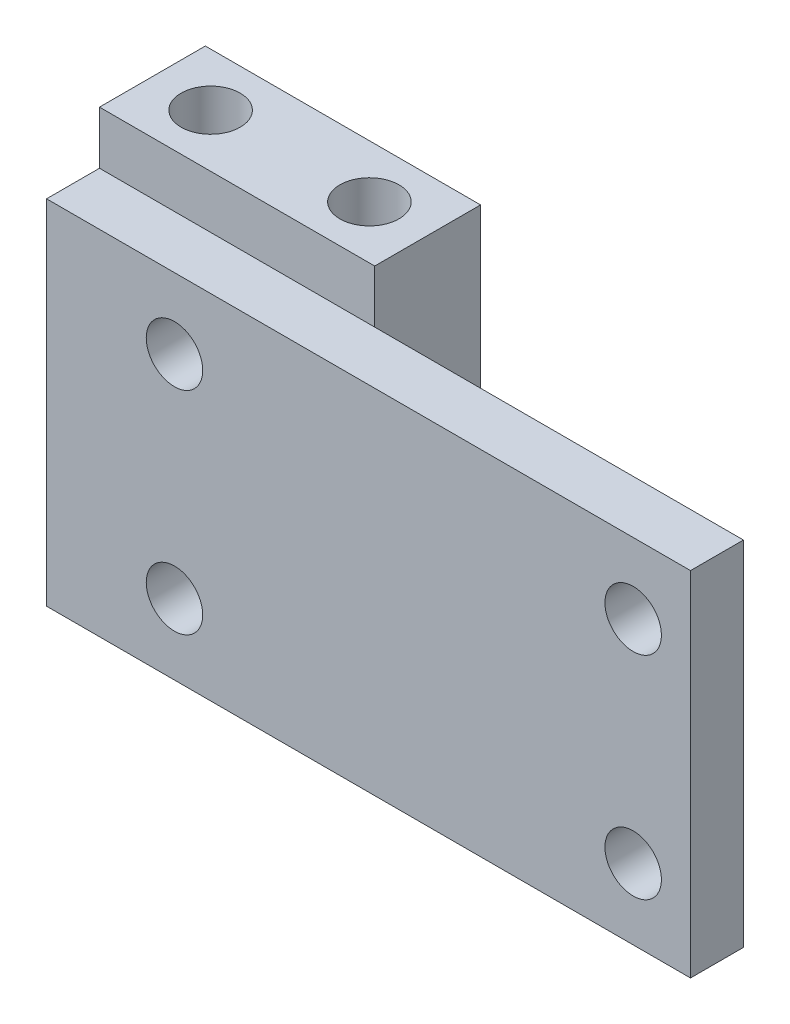
ISO-10303-21;
HEADER;
FILE_DESCRIPTION(('STEP AP214'),'2;1');
FILE_NAME('part.step','',(''),(''),'','','');
FILE_SCHEMA(('AUTOMOTIVE_DESIGN { 1 0 10303 214 1 1 1 1 }'));
ENDSEC;
DATA;
#1=APPLICATION_CONTEXT('core data for automotive mechanical design processes');
#2=APPLICATION_PROTOCOL_DEFINITION('international standard','automotive_design',2000,#1);
#3=PRODUCT_CONTEXT('',#1,'mechanical');
#4=PRODUCT('Part','Part','',(#3));
#5=PRODUCT_RELATED_PRODUCT_CATEGORY('part','',(#4));
#6=PRODUCT_DEFINITION_FORMATION('','',#4);
#7=PRODUCT_DEFINITION_CONTEXT('part definition',#1,'design');
#8=PRODUCT_DEFINITION('design','',#6,#7);
#9=PRODUCT_DEFINITION_SHAPE('','',#8);
#10=(LENGTH_UNIT() NAMED_UNIT(*) SI_UNIT(.MILLI.,.METRE.));
#11=(NAMED_UNIT(*) PLANE_ANGLE_UNIT() SI_UNIT($,.RADIAN.));
#12=(NAMED_UNIT(*) SI_UNIT($,.STERADIAN.) SOLID_ANGLE_UNIT());
#13=UNCERTAINTY_MEASURE_WITH_UNIT(LENGTH_MEASURE(1.E-05),#10,'distance_accuracy_value','');
#14=(GEOMETRIC_REPRESENTATION_CONTEXT(3) GLOBAL_UNCERTAINTY_ASSIGNED_CONTEXT((#13)) GLOBAL_UNIT_ASSIGNED_CONTEXT((#10,
#11,#12)) REPRESENTATION_CONTEXT('',''));
#15=CARTESIAN_POINT('',(0.,0.,0.));
#16=DIRECTION('',(0.,0.,1.));
#17=DIRECTION('',(1.,0.,0.));
#18=AXIS2_PLACEMENT_3D('',#15,#16,#17);
#19=CARTESIAN_POINT('',(0.,0.,6.));
#20=DIRECTION('',(0.,0.,-1.));
#21=DIRECTION('',(-1.,0.,0.));
#22=AXIS2_PLACEMENT_3D('',#19,#20,#21);
#23=PLANE('',#22);
#24=DIRECTION('',(-1.,0.,0.));
#25=VECTOR('',#24,1.);
#26=CARTESIAN_POINT('',(0.,23.,6.));
#27=LINE('',#26,#25);
#28=CARTESIAN_POINT('',(15.6,23.,6.));
#29=VERTEX_POINT('',#28);
#30=CARTESIAN_POINT('',(0.,23.,6.));
#31=VERTEX_POINT('',#30);
#32=EDGE_CURVE('E11',#29,#31,#27,.T.);
#33=ORIENTED_EDGE('',*,*,#32,.F.);
#34=DIRECTION('',(0.,1.,0.));
#35=VECTOR('',#34,1.);
#36=CARTESIAN_POINT('',(15.6,0.,6.));
#37=LINE('',#36,#35);
#38=CARTESIAN_POINT('',(15.6,26.,6.));
#39=VERTEX_POINT('',#38);
#40=EDGE_CURVE('E162',#29,#39,#37,.T.);
#41=ORIENTED_EDGE('',*,*,#40,.T.);
#42=DIRECTION('',(-1.,0.,0.));
#43=VECTOR('',#42,1.);
#44=CARTESIAN_POINT('',(0.,26.,6.));
#45=LINE('',#44,#43);
#46=CARTESIAN_POINT('',(0.,26.,6.));
#47=VERTEX_POINT('',#46);
#48=EDGE_CURVE('E165',#39,#47,#45,.T.);
#49=ORIENTED_EDGE('',*,*,#48,.T.);
#50=DIRECTION('',(0.,-1.,0.));
#51=VECTOR('',#50,1.);
#52=CARTESIAN_POINT('',(0.,0.,6.));
#53=LINE('',#52,#51);
#54=EDGE_CURVE('E158',#47,#31,#53,.T.);
#55=ORIENTED_EDGE('',*,*,#54,.T.);
#56=EDGE_LOOP('',(#33,#41,#49,#55));
#57=FACE_BOUND('',#56,.T.);
#58=ADVANCED_FACE('F33',(#57),#23,.F.);
#59=DIRECTION('',(1.,0.,0.));
#60=VECTOR('',#59,1.);
#61=CARTESIAN_POINT('',(0.,3.,6.));
#62=LINE('',#61,#60);
#63=CARTESIAN_POINT('',(0.,3.,6.));
#64=VERTEX_POINT('',#63);
#65=CARTESIAN_POINT('',(15.6,3.,6.));
#66=VERTEX_POINT('',#65);
#67=EDGE_CURVE('E57',#64,#66,#62,.T.);
#68=ORIENTED_EDGE('',*,*,#67,.F.);
#69=CARTESIAN_POINT('',(0.,0.,6.));
#70=VERTEX_POINT('',#69);
#71=EDGE_CURVE('E127',#64,#70,#53,.T.);
#72=ORIENTED_EDGE('',*,*,#71,.T.);
#73=DIRECTION('',(1.,0.,0.));
#74=VECTOR('',#73,1.);
#75=CARTESIAN_POINT('',(0.,0.,6.));
#76=LINE('',#75,#74);
#77=CARTESIAN_POINT('',(15.6,0.,6.));
#78=VERTEX_POINT('',#77);
#79=EDGE_CURVE('E160',#70,#78,#76,.T.);
#80=ORIENTED_EDGE('',*,*,#79,.T.);
#81=EDGE_CURVE('E163',#78,#66,#37,.T.);
#82=ORIENTED_EDGE('',*,*,#81,.T.);
#83=EDGE_LOOP('',(#68,#72,#80,#82));
#84=FACE_BOUND('',#83,.T.);
#85=ADVANCED_FACE('F285',(#84),#23,.F.);
#86=CARTESIAN_POINT('',(0.,0.,6.));
#87=DIRECTION('',(1.,0.,0.));
#88=DIRECTION('',(0.,0.,-1.));
#89=AXIS2_PLACEMENT_3D('',#86,#87,#88);
#90=PLANE('',#89);
#91=DIRECTION('',(0.,-1.,0.));
#92=VECTOR('',#91,1.);
#93=CARTESIAN_POINT('',(0.,0.,0.));
#94=LINE('',#93,#92);
#95=CARTESIAN_POINT('',(0.,26.,0.));
#96=VERTEX_POINT('',#95);
#97=CARTESIAN_POINT('',(0.,0.,0.));
#98=VERTEX_POINT('',#97);
#99=EDGE_CURVE('E149',#96,#98,#94,.T.);
#100=ORIENTED_EDGE('',*,*,#99,.T.);
#101=DIRECTION('',(0.,0.,-1.));
#102=VECTOR('',#101,1.);
#103=CARTESIAN_POINT('',(0.,0.,6.));
#104=LINE('',#103,#102);
#105=EDGE_CURVE('E42',#70,#98,#104,.T.);
#106=ORIENTED_EDGE('',*,*,#105,.F.);
#107=ORIENTED_EDGE('',*,*,#71,.F.);
#108=DIRECTION('',(0.,0.,-1.));
#109=VECTOR('',#108,1.);
#110=CARTESIAN_POINT('',(0.,3.,9.));
#111=LINE('',#110,#109);
#112=CARTESIAN_POINT('',(0.,3.,9.));
#113=VERTEX_POINT('',#112);
#114=EDGE_CURVE('E109',#113,#64,#111,.T.);
#115=ORIENTED_EDGE('',*,*,#114,.F.);
#116=DIRECTION('',(0.,-1.,0.));
#117=VECTOR('',#116,1.);
#118=CARTESIAN_POINT('',(0.,3.,9.));
#119=LINE('',#118,#117);
#120=CARTESIAN_POINT('',(0.,23.,9.));
#121=VERTEX_POINT('',#120);
#122=EDGE_CURVE('E115',#121,#113,#119,.T.);
#123=ORIENTED_EDGE('',*,*,#122,.F.);
#124=DIRECTION('',(0.,0.,-1.));
#125=VECTOR('',#124,1.);
#126=CARTESIAN_POINT('',(0.,23.,9.));
#127=LINE('',#126,#125);
#128=EDGE_CURVE('E219',#121,#31,#127,.T.);
#129=ORIENTED_EDGE('',*,*,#128,.T.);
#130=ORIENTED_EDGE('',*,*,#54,.F.);
#131=DIRECTION('',(0.,0.,-1.));
#132=VECTOR('',#131,1.);
#133=CARTESIAN_POINT('',(0.,26.,6.));
#134=LINE('',#133,#132);
#135=EDGE_CURVE('E168',#47,#96,#134,.T.);
#136=ORIENTED_EDGE('',*,*,#135,.T.);
#137=EDGE_LOOP('',(#100,#106,#107,#115,#123,#129,#130,#136));
#138=FACE_BOUND('',#137,.T.);
#139=ADVANCED_FACE('F35',(#138),#90,.F.);
#140=CARTESIAN_POINT('',(0.,0.,6.));
#141=DIRECTION('',(0.,1.,0.));
#142=DIRECTION('',(0.,0.,1.));
#143=AXIS2_PLACEMENT_3D('',#140,#141,#142);
#144=PLANE('',#143);
#145=CARTESIAN_POINT('',(12.3,0.,3.));
#146=DIRECTION('',(0.,-1.,0.));
#147=DIRECTION('',(0.,0.,-1.));
#148=AXIS2_PLACEMENT_3D('',#145,#146,#147);
#149=CIRCLE('',#148,1.675);
#150=CARTESIAN_POINT('',(12.3,0.,1.325));
#151=VERTEX_POINT('',#150);
#152=EDGE_CURVE('E141',#151,#151,#149,.T.);
#153=ORIENTED_EDGE('',*,*,#152,.F.);
#154=EDGE_LOOP('',(#153));
#155=FACE_BOUND('',#154,.T.);
#156=CARTESIAN_POINT('',(3.3,0.,3.));
#157=DIRECTION('',(0.,-1.,0.));
#158=DIRECTION('',(0.,0.,-1.));
#159=AXIS2_PLACEMENT_3D('',#156,#157,#158);
#160=CIRCLE('',#159,1.675);
#161=CARTESIAN_POINT('',(3.3,0.,1.325));
#162=VERTEX_POINT('',#161);
#163=EDGE_CURVE('E128',#162,#162,#160,.T.);
#164=ORIENTED_EDGE('',*,*,#163,.F.);
#165=EDGE_LOOP('',(#164));
#166=FACE_BOUND('',#165,.T.);
#167=DIRECTION('',(1.,0.,0.));
#168=VECTOR('',#167,1.);
#169=CARTESIAN_POINT('',(0.,0.,0.));
#170=LINE('',#169,#168);
#171=CARTESIAN_POINT('',(15.6,0.,0.));
#172=VERTEX_POINT('',#171);
#173=EDGE_CURVE('E170',#98,#172,#170,.T.);
#174=ORIENTED_EDGE('',*,*,#173,.T.);
#175=DIRECTION('',(0.,0.,-1.));
#176=VECTOR('',#175,1.);
#177=CARTESIAN_POINT('',(15.6,0.,6.));
#178=LINE('',#177,#176);
#179=EDGE_CURVE('E181',#78,#172,#178,.T.);
#180=ORIENTED_EDGE('',*,*,#179,.F.);
#181=ORIENTED_EDGE('',*,*,#79,.F.);
#182=ORIENTED_EDGE('',*,*,#105,.T.);
#183=EDGE_LOOP('',(#174,#180,#181,#182));
#184=FACE_BOUND('',#183,.T.);
#185=ADVANCED_FACE('F186',(#155,#166,#184),#144,.F.);
#186=CARTESIAN_POINT('',(15.6,0.,6.));
#187=DIRECTION('',(-1.,0.,0.));
#188=DIRECTION('',(0.,0.,1.));
#189=AXIS2_PLACEMENT_3D('',#186,#187,#188);
#190=PLANE('',#189);
#191=DIRECTION('',(0.,1.,0.));
#192=VECTOR('',#191,1.);
#193=CARTESIAN_POINT('',(15.6,0.,0.));
#194=LINE('',#193,#192);
#195=CARTESIAN_POINT('',(15.6,26.,0.));
#196=VERTEX_POINT('',#195);
#197=EDGE_CURVE('E172',#172,#196,#194,.T.);
#198=ORIENTED_EDGE('',*,*,#197,.T.);
#199=DIRECTION('',(0.,0.,-1.));
#200=VECTOR('',#199,1.);
#201=CARTESIAN_POINT('',(15.6,26.,6.));
#202=LINE('',#201,#200);
#203=EDGE_CURVE('E178',#39,#196,#202,.T.);
#204=ORIENTED_EDGE('',*,*,#203,.F.);
#205=ORIENTED_EDGE('',*,*,#40,.F.);
#206=EDGE_CURVE('E166',#66,#29,#37,.T.);
#207=ORIENTED_EDGE('',*,*,#206,.F.);
#208=ORIENTED_EDGE('',*,*,#81,.F.);
#209=ORIENTED_EDGE('',*,*,#179,.T.);
#210=EDGE_LOOP('',(#198,#204,#205,#207,#208,#209));
#211=FACE_BOUND('',#210,.T.);
#212=ADVANCED_FACE('F197',(#211),#190,.F.);
#213=CARTESIAN_POINT('',(0.,26.,6.));
#214=DIRECTION('',(0.,-1.,0.));
#215=DIRECTION('',(0.,0.,-1.));
#216=AXIS2_PLACEMENT_3D('',#213,#214,#215);
#217=PLANE('',#216);
#218=CARTESIAN_POINT('',(3.3,26.,3.));
#219=DIRECTION('',(0.,1.,0.));
#220=DIRECTION('',(0.,0.,1.));
#221=AXIS2_PLACEMENT_3D('',#218,#219,#220);
#222=CIRCLE('',#221,1.675);
#223=CARTESIAN_POINT('',(3.3,26.,4.675));
#224=VERTEX_POINT('',#223);
#225=EDGE_CURVE('E150',#224,#224,#222,.T.);
#226=ORIENTED_EDGE('',*,*,#225,.F.);
#227=EDGE_LOOP('',(#226));
#228=FACE_BOUND('',#227,.T.);
#229=CARTESIAN_POINT('',(12.3,26.,3.));
#230=DIRECTION('',(0.,1.,0.));
#231=DIRECTION('',(0.,0.,1.));
#232=AXIS2_PLACEMENT_3D('',#229,#230,#231);
#233=CIRCLE('',#232,1.675);
#234=CARTESIAN_POINT('',(12.3,26.,4.675));
#235=VERTEX_POINT('',#234);
#236=EDGE_CURVE('E140',#235,#235,#233,.T.);
#237=ORIENTED_EDGE('',*,*,#236,.F.);
#238=EDGE_LOOP('',(#237));
#239=FACE_BOUND('',#238,.T.);
#240=DIRECTION('',(-1.,0.,0.));
#241=VECTOR('',#240,1.);
#242=CARTESIAN_POINT('',(0.,26.,0.));
#243=LINE('',#242,#241);
#244=EDGE_CURVE('E174',#196,#96,#243,.T.);
#245=ORIENTED_EDGE('',*,*,#244,.T.);
#246=ORIENTED_EDGE('',*,*,#135,.F.);
#247=ORIENTED_EDGE('',*,*,#48,.F.);
#248=ORIENTED_EDGE('',*,*,#203,.T.);
#249=EDGE_LOOP('',(#245,#246,#247,#248));
#250=FACE_BOUND('',#249,.T.);
#251=ADVANCED_FACE('F201',(#228,#239,#250),#217,.F.);
#252=CARTESIAN_POINT('',(0.,0.,0.));
#253=DIRECTION('',(0.,0.,-1.));
#254=DIRECTION('',(-1.,0.,0.));
#255=AXIS2_PLACEMENT_3D('',#252,#253,#254);
#256=PLANE('',#255);
#257=CARTESIAN_POINT('',(7.25,19.,0.));
#258=DIRECTION('',(0.,0.,-1.));
#259=DIRECTION('',(-1.,0.,0.));
#260=AXIS2_PLACEMENT_3D('',#257,#258,#259);
#261=CIRCLE('',#260,3.3);
#262=CARTESIAN_POINT('',(3.95,19.,0.));
#263=VERTEX_POINT('',#262);
#264=EDGE_CURVE('E255',#263,#263,#261,.T.);
#265=ORIENTED_EDGE('',*,*,#264,.F.);
#266=EDGE_LOOP('',(#265));
#267=FACE_BOUND('',#266,.T.);
#268=CARTESIAN_POINT('',(7.25,7.,0.));
#269=DIRECTION('',(0.,0.,-1.));
#270=DIRECTION('',(-1.,0.,0.));
#271=AXIS2_PLACEMENT_3D('',#268,#269,#270);
#272=CIRCLE('',#271,3.3);
#273=CARTESIAN_POINT('',(3.95,7.,0.));
#274=VERTEX_POINT('',#273);
#275=EDGE_CURVE('E243',#274,#274,#272,.T.);
#276=ORIENTED_EDGE('',*,*,#275,.F.);
#277=EDGE_LOOP('',(#276));
#278=FACE_BOUND('',#277,.T.);
#279=ORIENTED_EDGE('',*,*,#99,.F.);
#280=ORIENTED_EDGE('',*,*,#244,.F.);
#281=ORIENTED_EDGE('',*,*,#197,.F.);
#282=ORIENTED_EDGE('',*,*,#173,.F.);
#283=EDGE_LOOP('',(#279,#280,#281,#282));
#284=FACE_BOUND('',#283,.T.);
#285=ADVANCED_FACE('F193',(#267,#278,#284),#256,.T.);
#286=CARTESIAN_POINT('',(12.3,21.5,3.));
#287=DIRECTION('',(0.,1.,0.));
#288=DIRECTION('',(0.,0.,1.));
#289=AXIS2_PLACEMENT_3D('',#286,#287,#288);
#290=CYLINDRICAL_SURFACE('',#289,1.675);
#291=CARTESIAN_POINT('',(12.3,21.5,3.));
#292=DIRECTION('',(0.,1.,0.));
#293=DIRECTION('',(0.,0.,1.));
#294=AXIS2_PLACEMENT_3D('',#291,#292,#293);
#295=CIRCLE('',#294,1.675);
#296=CARTESIAN_POINT('',(12.3,21.5,4.675));
#297=VERTEX_POINT('',#296);
#298=EDGE_CURVE('E153',#297,#297,#295,.T.);
#299=ORIENTED_EDGE('',*,*,#298,.F.);
#300=EDGE_LOOP('',(#299));
#301=FACE_BOUND('',#300,.T.);
#302=ORIENTED_EDGE('',*,*,#236,.T.);
#303=EDGE_LOOP('',(#302));
#304=FACE_BOUND('',#303,.T.);
#305=ADVANCED_FACE('F263',(#301,#304),#290,.F.);
#306=CARTESIAN_POINT('',(12.3,21.5,3.));
#307=DIRECTION('',(0.,1.,0.));
#308=DIRECTION('',(0.,0.,1.));
#309=AXIS2_PLACEMENT_3D('',#306,#307,#308);
#310=PLANE('',#309);
#311=ORIENTED_EDGE('',*,*,#298,.T.);
#312=EDGE_LOOP('',(#311));
#313=FACE_BOUND('',#312,.T.);
#314=ADVANCED_FACE('F328',(#313),#310,.T.);
#315=CARTESIAN_POINT('',(3.3,21.5,3.));
#316=DIRECTION('',(0.,1.,0.));
#317=DIRECTION('',(0.,0.,1.));
#318=AXIS2_PLACEMENT_3D('',#315,#316,#317);
#319=CYLINDRICAL_SURFACE('',#318,1.675);
#320=CARTESIAN_POINT('',(3.3,21.5,3.));
#321=DIRECTION('',(0.,1.,0.));
#322=DIRECTION('',(0.,0.,1.));
#323=AXIS2_PLACEMENT_3D('',#320,#321,#322);
#324=CIRCLE('',#323,1.675);
#325=CARTESIAN_POINT('',(3.3,21.5,4.675));
#326=VERTEX_POINT('',#325);
#327=EDGE_CURVE('E146',#326,#326,#324,.T.);
#328=ORIENTED_EDGE('',*,*,#327,.F.);
#329=EDGE_LOOP('',(#328));
#330=FACE_BOUND('',#329,.T.);
#331=ORIENTED_EDGE('',*,*,#225,.T.);
#332=EDGE_LOOP('',(#331));
#333=FACE_BOUND('',#332,.T.);
#334=ADVANCED_FACE('F321',(#330,#333),#319,.F.);
#335=CARTESIAN_POINT('',(3.3,21.5,3.));
#336=DIRECTION('',(0.,1.,0.));
#337=DIRECTION('',(0.,0.,1.));
#338=AXIS2_PLACEMENT_3D('',#335,#336,#337);
#339=PLANE('',#338);
#340=ORIENTED_EDGE('',*,*,#327,.T.);
#341=EDGE_LOOP('',(#340));
#342=FACE_BOUND('',#341,.T.);
#343=ADVANCED_FACE('F312',(#342),#339,.T.);
#344=CARTESIAN_POINT('',(3.3,4.5,3.));
#345=DIRECTION('',(0.,-1.,0.));
#346=DIRECTION('',(0.,0.,-1.));
#347=AXIS2_PLACEMENT_3D('',#344,#345,#346);
#348=CYLINDRICAL_SURFACE('',#347,1.675);
#349=CARTESIAN_POINT('',(3.3,4.5,3.));
#350=DIRECTION('',(0.,-1.,0.));
#351=DIRECTION('',(0.,0.,-1.));
#352=AXIS2_PLACEMENT_3D('',#349,#350,#351);
#353=CIRCLE('',#352,1.675);
#354=CARTESIAN_POINT('',(3.3,4.5,1.325));
#355=VERTEX_POINT('',#354);
#356=EDGE_CURVE('E131',#355,#355,#353,.T.);
#357=ORIENTED_EDGE('',*,*,#356,.F.);
#358=EDGE_LOOP('',(#357));
#359=FACE_BOUND('',#358,.T.);
#360=ORIENTED_EDGE('',*,*,#163,.T.);
#361=EDGE_LOOP('',(#360));
#362=FACE_BOUND('',#361,.T.);
#363=ADVANCED_FACE('F309',(#359,#362),#348,.F.);
#364=CARTESIAN_POINT('',(3.3,4.5,3.));
#365=DIRECTION('',(0.,-1.,0.));
#366=DIRECTION('',(0.,0.,-1.));
#367=AXIS2_PLACEMENT_3D('',#364,#365,#366);
#368=PLANE('',#367);
#369=ORIENTED_EDGE('',*,*,#356,.T.);
#370=EDGE_LOOP('',(#369));
#371=FACE_BOUND('',#370,.T.);
#372=ADVANCED_FACE('F311',(#371),#368,.T.);
#373=CARTESIAN_POINT('',(12.3,4.5,3.));
#374=DIRECTION('',(0.,-1.,0.));
#375=DIRECTION('',(0.,0.,-1.));
#376=AXIS2_PLACEMENT_3D('',#373,#374,#375);
#377=CYLINDRICAL_SURFACE('',#376,1.675);
#378=CARTESIAN_POINT('',(12.3,4.5,3.));
#379=DIRECTION('',(0.,-1.,0.));
#380=DIRECTION('',(0.,0.,-1.));
#381=AXIS2_PLACEMENT_3D('',#378,#379,#380);
#382=CIRCLE('',#381,1.675);
#383=CARTESIAN_POINT('',(12.3,4.5,1.325));
#384=VERTEX_POINT('',#383);
#385=EDGE_CURVE('E137',#384,#384,#382,.T.);
#386=ORIENTED_EDGE('',*,*,#385,.F.);
#387=EDGE_LOOP('',(#386));
#388=FACE_BOUND('',#387,.T.);
#389=ORIENTED_EDGE('',*,*,#152,.T.);
#390=EDGE_LOOP('',(#389));
#391=FACE_BOUND('',#390,.T.);
#392=ADVANCED_FACE('F318',(#388,#391),#377,.F.);
#393=CARTESIAN_POINT('',(12.3,4.5,3.));
#394=DIRECTION('',(0.,-1.,0.));
#395=DIRECTION('',(0.,0.,-1.));
#396=AXIS2_PLACEMENT_3D('',#393,#394,#395);
#397=PLANE('',#396);
#398=ORIENTED_EDGE('',*,*,#385,.T.);
#399=EDGE_LOOP('',(#398));
#400=FACE_BOUND('',#399,.T.);
#401=ADVANCED_FACE('F387',(#400),#397,.T.);
#402=CARTESIAN_POINT('',(0.,3.,9.));
#403=DIRECTION('',(0.,1.,0.));
#404=DIRECTION('',(-1.,0.,0.));
#405=AXIS2_PLACEMENT_3D('',#402,#403,#404);
#406=PLANE('',#405);
#407=ORIENTED_EDGE('',*,*,#67,.T.);
#408=CARTESIAN_POINT('',(36.5,3.,6.));
#409=VERTEX_POINT('',#408);
#410=EDGE_CURVE('E210',#66,#409,#62,.T.);
#411=ORIENTED_EDGE('',*,*,#410,.T.);
#412=DIRECTION('',(0.,0.,-1.));
#413=VECTOR('',#412,1.);
#414=CARTESIAN_POINT('',(36.5,3.,9.));
#415=LINE('',#414,#413);
#416=CARTESIAN_POINT('',(36.5,3.,9.));
#417=VERTEX_POINT('',#416);
#418=EDGE_CURVE('E111',#417,#409,#415,.T.);
#419=ORIENTED_EDGE('',*,*,#418,.F.);
#420=DIRECTION('',(1.,0.,0.));
#421=VECTOR('',#420,1.);
#422=CARTESIAN_POINT('',(0.,3.,9.));
#423=LINE('',#422,#421);
#424=EDGE_CURVE('E105',#113,#417,#423,.T.);
#425=ORIENTED_EDGE('',*,*,#424,.F.);
#426=ORIENTED_EDGE('',*,*,#114,.T.);
#427=EDGE_LOOP('',(#407,#411,#419,#425,#426));
#428=FACE_BOUND('',#427,.T.);
#429=ADVANCED_FACE('F107',(#428),#406,.F.);
#430=CARTESIAN_POINT('',(36.5,3.,9.));
#431=DIRECTION('',(-1.,0.,0.));
#432=DIRECTION('',(0.,0.,1.));
#433=AXIS2_PLACEMENT_3D('',#430,#431,#432);
#434=PLANE('',#433);
#435=DIRECTION('',(0.,1.,0.));
#436=VECTOR('',#435,1.);
#437=CARTESIAN_POINT('',(36.5,3.,6.));
#438=LINE('',#437,#436);
#439=CARTESIAN_POINT('',(36.5,23.,6.));
#440=VERTEX_POINT('',#439);
#441=EDGE_CURVE('E215',#409,#440,#438,.T.);
#442=ORIENTED_EDGE('',*,*,#441,.T.);
#443=DIRECTION('',(0.,0.,-1.));
#444=VECTOR('',#443,1.);
#445=CARTESIAN_POINT('',(36.5,23.,9.));
#446=LINE('',#445,#444);
#447=CARTESIAN_POINT('',(36.5,23.,9.));
#448=VERTEX_POINT('',#447);
#449=EDGE_CURVE('E133',#448,#440,#446,.T.);
#450=ORIENTED_EDGE('',*,*,#449,.F.);
#451=DIRECTION('',(0.,1.,0.));
#452=VECTOR('',#451,1.);
#453=CARTESIAN_POINT('',(36.5,3.,9.));
#454=LINE('',#453,#452);
#455=EDGE_CURVE('E114',#417,#448,#454,.T.);
#456=ORIENTED_EDGE('',*,*,#455,.F.);
#457=ORIENTED_EDGE('',*,*,#418,.T.);
#458=EDGE_LOOP('',(#442,#450,#456,#457));
#459=FACE_BOUND('',#458,.T.);
#460=ADVANCED_FACE('F386',(#459),#434,.F.);
#461=CARTESIAN_POINT('',(0.,23.,9.));
#462=DIRECTION('',(0.,-1.,0.));
#463=DIRECTION('',(0.,0.,-1.));
#464=AXIS2_PLACEMENT_3D('',#461,#462,#463);
#465=PLANE('',#464);
#466=EDGE_CURVE('E44',#440,#29,#27,.T.);
#467=ORIENTED_EDGE('',*,*,#466,.T.);
#468=ORIENTED_EDGE('',*,*,#32,.T.);
#469=ORIENTED_EDGE('',*,*,#128,.F.);
#470=DIRECTION('',(-1.,0.,0.));
#471=VECTOR('',#470,1.);
#472=CARTESIAN_POINT('',(0.,23.,9.));
#473=LINE('',#472,#471);
#474=EDGE_CURVE('E120',#448,#121,#473,.T.);
#475=ORIENTED_EDGE('',*,*,#474,.F.);
#476=ORIENTED_EDGE('',*,*,#449,.T.);
#477=EDGE_LOOP('',(#467,#468,#469,#475,#476));
#478=FACE_BOUND('',#477,.T.);
#479=ADVANCED_FACE('F213',(#478),#465,.F.);
#480=CARTESIAN_POINT('',(0.,0.,9.));
#481=DIRECTION('',(0.,0.,-1.));
#482=DIRECTION('',(-1.,0.,0.));
#483=AXIS2_PLACEMENT_3D('',#480,#481,#482);
#484=PLANE('',#483);
#485=CARTESIAN_POINT('',(7.25,19.,9.));
#486=DIRECTION('',(0.,0.,-1.));
#487=DIRECTION('',(-1.,0.,0.));
#488=AXIS2_PLACEMENT_3D('',#485,#486,#487);
#489=CIRCLE('',#488,1.6);
#490=CARTESIAN_POINT('',(5.65,19.,9.));
#491=VERTEX_POINT('',#490);
#492=EDGE_CURVE('E246',#491,#491,#489,.T.);
#493=ORIENTED_EDGE('',*,*,#492,.T.);
#494=EDGE_LOOP('',(#493));
#495=FACE_BOUND('',#494,.T.);
#496=CARTESIAN_POINT('',(7.25,7.,9.));
#497=DIRECTION('',(0.,0.,-1.));
#498=DIRECTION('',(-1.,0.,0.));
#499=AXIS2_PLACEMENT_3D('',#496,#497,#498);
#500=CIRCLE('',#499,1.6);
#501=CARTESIAN_POINT('',(5.65,7.,9.));
#502=VERTEX_POINT('',#501);
#503=EDGE_CURVE('E234',#502,#502,#500,.T.);
#504=ORIENTED_EDGE('',*,*,#503,.T.);
#505=EDGE_LOOP('',(#504));
#506=FACE_BOUND('',#505,.T.);
#507=CARTESIAN_POINT('',(33.25,7.,9.));
#508=DIRECTION('',(0.,0.,-1.));
#509=DIRECTION('',(-1.,0.,0.));
#510=AXIS2_PLACEMENT_3D('',#507,#508,#509);
#511=CIRCLE('',#510,1.6);
#512=CARTESIAN_POINT('',(31.65,7.,9.));
#513=VERTEX_POINT('',#512);
#514=EDGE_CURVE('E231',#513,#513,#511,.T.);
#515=ORIENTED_EDGE('',*,*,#514,.T.);
#516=EDGE_LOOP('',(#515));
#517=FACE_BOUND('',#516,.T.);
#518=CARTESIAN_POINT('',(33.25,19.,9.));
#519=DIRECTION('',(0.,0.,-1.));
#520=DIRECTION('',(-1.,0.,0.));
#521=AXIS2_PLACEMENT_3D('',#518,#519,#520);
#522=CIRCLE('',#521,1.6);
#523=CARTESIAN_POINT('',(31.65,19.,9.));
#524=VERTEX_POINT('',#523);
#525=EDGE_CURVE('E224',#524,#524,#522,.T.);
#526=ORIENTED_EDGE('',*,*,#525,.T.);
#527=EDGE_LOOP('',(#526));
#528=FACE_BOUND('',#527,.T.);
#529=ORIENTED_EDGE('',*,*,#122,.T.);
#530=ORIENTED_EDGE('',*,*,#424,.T.);
#531=ORIENTED_EDGE('',*,*,#455,.T.);
#532=ORIENTED_EDGE('',*,*,#474,.T.);
#533=EDGE_LOOP('',(#529,#530,#531,#532));
#534=FACE_BOUND('',#533,.T.);
#535=ADVANCED_FACE('F118',(#495,#506,#517,#528,#534),#484,.F.);
#536=CARTESIAN_POINT('',(0.,0.,6.));
#537=DIRECTION('',(0.,0.,-1.));
#538=DIRECTION('',(-1.,0.,0.));
#539=AXIS2_PLACEMENT_3D('',#536,#537,#538);
#540=PLANE('',#539);
#541=CARTESIAN_POINT('',(33.25,7.,6.));
#542=DIRECTION('',(0.,0.,-1.));
#543=DIRECTION('',(-1.,0.,0.));
#544=AXIS2_PLACEMENT_3D('',#541,#542,#543);
#545=CIRCLE('',#544,1.6);
#546=CARTESIAN_POINT('',(31.65,7.,6.));
#547=VERTEX_POINT('',#546);
#548=EDGE_CURVE('E37',#547,#547,#545,.T.);
#549=ORIENTED_EDGE('',*,*,#548,.F.);
#550=EDGE_LOOP('',(#549));
#551=FACE_BOUND('',#550,.T.);
#552=CARTESIAN_POINT('',(33.25,19.,6.));
#553=DIRECTION('',(0.,0.,-1.));
#554=DIRECTION('',(-1.,0.,0.));
#555=AXIS2_PLACEMENT_3D('',#552,#553,#554);
#556=CIRCLE('',#555,1.6);
#557=CARTESIAN_POINT('',(31.65,19.,6.));
#558=VERTEX_POINT('',#557);
#559=EDGE_CURVE('E222',#558,#558,#556,.T.);
#560=ORIENTED_EDGE('',*,*,#559,.F.);
#561=EDGE_LOOP('',(#560));
#562=FACE_BOUND('',#561,.T.);
#563=ORIENTED_EDGE('',*,*,#410,.F.);
#564=ORIENTED_EDGE('',*,*,#206,.T.);
#565=ORIENTED_EDGE('',*,*,#466,.F.);
#566=ORIENTED_EDGE('',*,*,#441,.F.);
#567=EDGE_LOOP('',(#563,#564,#565,#566));
#568=FACE_BOUND('',#567,.T.);
#569=ADVANCED_FACE('F208',(#551,#562,#568),#540,.T.);
#570=CARTESIAN_POINT('',(33.25,19.,0.));
#571=DIRECTION('',(0.,0.,-1.));
#572=DIRECTION('',(-1.,0.,0.));
#573=AXIS2_PLACEMENT_3D('',#570,#571,#572);
#574=CYLINDRICAL_SURFACE('',#573,1.6);
#575=ORIENTED_EDGE('',*,*,#559,.T.);
#576=EDGE_LOOP('',(#575));
#577=FACE_BOUND('',#576,.T.);
#578=ORIENTED_EDGE('',*,*,#525,.F.);
#579=EDGE_LOOP('',(#578));
#580=FACE_BOUND('',#579,.T.);
#581=ADVANCED_FACE('F416',(#577,#580),#574,.F.);
#582=CARTESIAN_POINT('',(33.25,7.,0.));
#583=DIRECTION('',(0.,0.,-1.));
#584=DIRECTION('',(-1.,0.,0.));
#585=AXIS2_PLACEMENT_3D('',#582,#583,#584);
#586=CYLINDRICAL_SURFACE('',#585,1.6);
#587=ORIENTED_EDGE('',*,*,#548,.T.);
#588=EDGE_LOOP('',(#587));
#589=FACE_BOUND('',#588,.T.);
#590=ORIENTED_EDGE('',*,*,#514,.F.);
#591=EDGE_LOOP('',(#590));
#592=FACE_BOUND('',#591,.T.);
#593=ADVANCED_FACE('F425',(#589,#592),#586,.F.);
#594=CARTESIAN_POINT('',(7.25,7.,0.));
#595=DIRECTION('',(0.,0.,-1.));
#596=DIRECTION('',(-1.,0.,0.));
#597=AXIS2_PLACEMENT_3D('',#594,#595,#596);
#598=CYLINDRICAL_SURFACE('',#597,1.6);
#599=ORIENTED_EDGE('',*,*,#503,.F.);
#600=EDGE_LOOP('',(#599));
#601=FACE_BOUND('',#600,.T.);
#602=CARTESIAN_POINT('',(7.25,7.,3.));
#603=DIRECTION('',(0.,0.,-1.));
#604=DIRECTION('',(-1.,0.,0.));
#605=AXIS2_PLACEMENT_3D('',#602,#603,#604);
#606=CIRCLE('',#605,1.6);
#607=CARTESIAN_POINT('',(5.65,7.,3.));
#608=VERTEX_POINT('',#607);
#609=EDGE_CURVE('E237',#608,#608,#606,.T.);
#610=ORIENTED_EDGE('',*,*,#609,.T.);
#611=EDGE_LOOP('',(#610));
#612=FACE_BOUND('',#611,.T.);
#613=ADVANCED_FACE('F280',(#601,#612),#598,.F.);
#614=CARTESIAN_POINT('',(8.85,7.,3.));
#615=DIRECTION('',(0.,0.,1.));
#616=DIRECTION('',(1.,0.,0.));
#617=AXIS2_PLACEMENT_3D('',#614,#615,#616);
#618=PLANE('',#617);
#619=ORIENTED_EDGE('',*,*,#609,.F.);
#620=EDGE_LOOP('',(#619));
#621=FACE_BOUND('',#620,.T.);
#622=CARTESIAN_POINT('',(7.25,7.,3.));
#623=DIRECTION('',(0.,0.,-1.));
#624=DIRECTION('',(-1.,0.,0.));
#625=AXIS2_PLACEMENT_3D('',#622,#623,#624);
#626=CIRCLE('',#625,3.3);
#627=CARTESIAN_POINT('',(3.95,7.,3.));
#628=VERTEX_POINT('',#627);
#629=EDGE_CURVE('E240',#628,#628,#626,.T.);
#630=ORIENTED_EDGE('',*,*,#629,.T.);
#631=EDGE_LOOP('',(#630));
#632=FACE_BOUND('',#631,.T.);
#633=ADVANCED_FACE('F270',(#621,#632),#618,.F.);
#634=CARTESIAN_POINT('',(7.25,7.,0.));
#635=DIRECTION('',(0.,0.,-1.));
#636=DIRECTION('',(-1.,0.,0.));
#637=AXIS2_PLACEMENT_3D('',#634,#635,#636);
#638=CYLINDRICAL_SURFACE('',#637,3.3);
#639=ORIENTED_EDGE('',*,*,#629,.F.);
#640=EDGE_LOOP('',(#639));
#641=FACE_BOUND('',#640,.T.);
#642=ORIENTED_EDGE('',*,*,#275,.T.);
#643=EDGE_LOOP('',(#642));
#644=FACE_BOUND('',#643,.T.);
#645=ADVANCED_FACE('F267',(#641,#644),#638,.F.);
#646=CARTESIAN_POINT('',(7.25,19.,0.));
#647=DIRECTION('',(0.,0.,-1.));
#648=DIRECTION('',(-1.,0.,0.));
#649=AXIS2_PLACEMENT_3D('',#646,#647,#648);
#650=CYLINDRICAL_SURFACE('',#649,1.6);
#651=ORIENTED_EDGE('',*,*,#492,.F.);
#652=EDGE_LOOP('',(#651));
#653=FACE_BOUND('',#652,.T.);
#654=CARTESIAN_POINT('',(7.25,19.,3.));
#655=DIRECTION('',(0.,0.,-1.));
#656=DIRECTION('',(-1.,0.,0.));
#657=AXIS2_PLACEMENT_3D('',#654,#655,#656);
#658=CIRCLE('',#657,1.6);
#659=CARTESIAN_POINT('',(5.65,19.,3.));
#660=VERTEX_POINT('',#659);
#661=EDGE_CURVE('E249',#660,#660,#658,.T.);
#662=ORIENTED_EDGE('',*,*,#661,.T.);
#663=EDGE_LOOP('',(#662));
#664=FACE_BOUND('',#663,.T.);
#665=ADVANCED_FACE('F269',(#653,#664),#650,.F.);
#666=CARTESIAN_POINT('',(8.85,19.,3.));
#667=DIRECTION('',(0.,0.,1.));
#668=DIRECTION('',(1.,0.,0.));
#669=AXIS2_PLACEMENT_3D('',#666,#667,#668);
#670=PLANE('',#669);
#671=ORIENTED_EDGE('',*,*,#661,.F.);
#672=EDGE_LOOP('',(#671));
#673=FACE_BOUND('',#672,.T.);
#674=CARTESIAN_POINT('',(7.25,19.,3.));
#675=DIRECTION('',(0.,0.,-1.));
#676=DIRECTION('',(-1.,0.,0.));
#677=AXIS2_PLACEMENT_3D('',#674,#675,#676);
#678=CIRCLE('',#677,3.3);
#679=CARTESIAN_POINT('',(3.95,19.,3.));
#680=VERTEX_POINT('',#679);
#681=EDGE_CURVE('E252',#680,#680,#678,.T.);
#682=ORIENTED_EDGE('',*,*,#681,.T.);
#683=EDGE_LOOP('',(#682));
#684=FACE_BOUND('',#683,.T.);
#685=ADVANCED_FACE('F277',(#673,#684),#670,.F.);
#686=CARTESIAN_POINT('',(7.25,19.,0.));
#687=DIRECTION('',(0.,0.,-1.));
#688=DIRECTION('',(-1.,0.,0.));
#689=AXIS2_PLACEMENT_3D('',#686,#687,#688);
#690=CYLINDRICAL_SURFACE('',#689,3.3);
#691=ORIENTED_EDGE('',*,*,#681,.F.);
#692=EDGE_LOOP('',(#691));
#693=FACE_BOUND('',#692,.T.);
#694=ORIENTED_EDGE('',*,*,#264,.T.);
#695=EDGE_LOOP('',(#694));
#696=FACE_BOUND('',#695,.T.);
#697=ADVANCED_FACE('F259',(#693,#696),#690,.F.);
#698=CLOSED_SHELL('',(#58,#85,#139,#185,#212,#251,#285,#305,#314,#334,#343,#363,#372,#392,#401,
#429,#460,#479,#535,#569,#581,#593,#613,#633,#645,#665,#685,#697));
#699=MANIFOLD_SOLID_BREP('B2',#698);
#700=ADVANCED_BREP_SHAPE_REPRESENTATION('',(#18,#699),#14);
#701=SHAPE_DEFINITION_REPRESENTATION(#9,#700);
ENDSEC;
END-ISO-10303-21;
